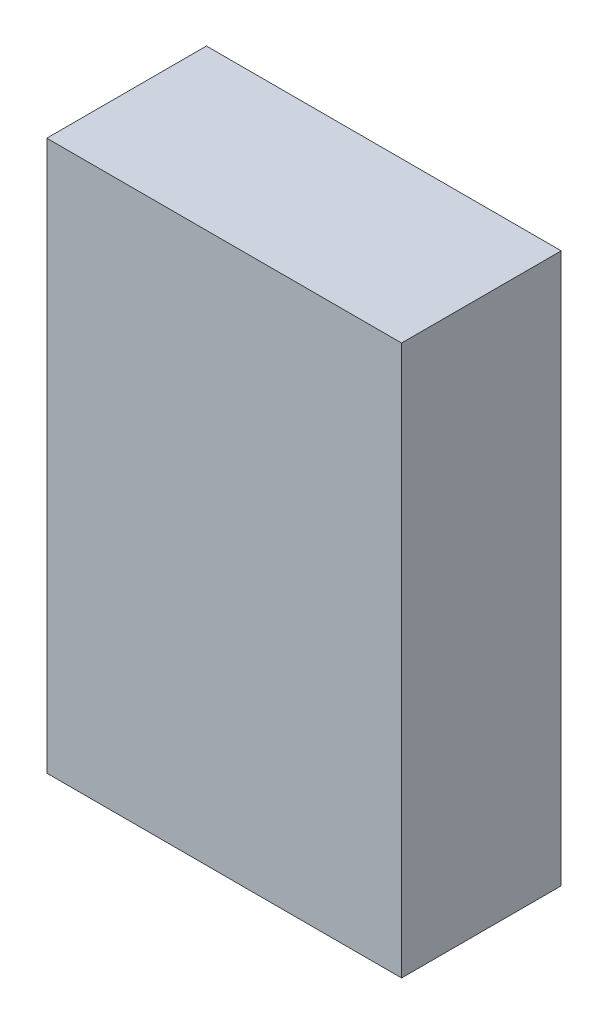
ISO-10303-21;
HEADER;
FILE_DESCRIPTION(('STEP AP214'),'2;1');
FILE_NAME('part.step','',(''),(''),'','','');
FILE_SCHEMA(('AUTOMOTIVE_DESIGN { 1 0 10303 214 1 1 1 1 }'));
ENDSEC;
DATA;
#1=APPLICATION_CONTEXT('core data for automotive mechanical design processes');
#2=APPLICATION_PROTOCOL_DEFINITION('international standard','automotive_design',2000,#1);
#3=PRODUCT_CONTEXT('',#1,'mechanical');
#4=PRODUCT('Part','Part','',(#3));
#5=PRODUCT_RELATED_PRODUCT_CATEGORY('part','',(#4));
#6=PRODUCT_DEFINITION_FORMATION('','',#4);
#7=PRODUCT_DEFINITION_CONTEXT('part definition',#1,'design');
#8=PRODUCT_DEFINITION('design','',#6,#7);
#9=PRODUCT_DEFINITION_SHAPE('','',#8);
#10=(LENGTH_UNIT() NAMED_UNIT(*) SI_UNIT(.MILLI.,.METRE.));
#11=(NAMED_UNIT(*) PLANE_ANGLE_UNIT() SI_UNIT($,.RADIAN.));
#12=(NAMED_UNIT(*) SI_UNIT($,.STERADIAN.) SOLID_ANGLE_UNIT());
#13=UNCERTAINTY_MEASURE_WITH_UNIT(LENGTH_MEASURE(1.E-05),#10,'distance_accuracy_value','');
#14=(GEOMETRIC_REPRESENTATION_CONTEXT(3) GLOBAL_UNCERTAINTY_ASSIGNED_CONTEXT((#13)) GLOBAL_UNIT_ASSIGNED_CONTEXT((#10,
#11,#12)) REPRESENTATION_CONTEXT('',''));
#15=CARTESIAN_POINT('',(0.,0.,0.));
#16=DIRECTION('',(0.,0.,1.));
#17=DIRECTION('',(1.,0.,0.));
#18=AXIS2_PLACEMENT_3D('',#15,#16,#17);
#19=CARTESIAN_POINT('',(-28.0820979020979,37.0905128205128,9.));
#20=DIRECTION('',(1.,0.,0.));
#21=DIRECTION('',(0.,0.,-1.));
#22=AXIS2_PLACEMENT_3D('',#19,#20,#21);
#23=PLANE('',#22);
#24=DIRECTION('',(0.,-1.,0.));
#25=VECTOR('',#24,1.);
#26=CARTESIAN_POINT('',(-28.0820979020979,37.0905128205128,0.));
#27=LINE('',#26,#25);
#28=CARTESIAN_POINT('',(-28.0820979020979,37.0905128205128,0.));
#29=VERTEX_POINT('',#28);
#30=CARTESIAN_POINT('',(-28.0820979020979,6.09051282051283,0.));
#31=VERTEX_POINT('',#30);
#32=EDGE_CURVE('E94',#29,#31,#27,.T.);
#33=ORIENTED_EDGE('',*,*,#32,.T.);
#34=DIRECTION('',(0.,0.,-1.));
#35=VECTOR('',#34,1.);
#36=CARTESIAN_POINT('',(-28.0820979020979,6.09051282051283,9.));
#37=LINE('',#36,#35);
#38=CARTESIAN_POINT('',(-28.0820979020979,6.09051282051283,9.));
#39=VERTEX_POINT('',#38);
#40=EDGE_CURVE('E11',#39,#31,#37,.T.);
#41=ORIENTED_EDGE('',*,*,#40,.F.);
#42=DIRECTION('',(0.,-1.,0.));
#43=VECTOR('',#42,1.);
#44=CARTESIAN_POINT('',(-28.0820979020979,37.0905128205128,9.));
#45=LINE('',#44,#43);
#46=CARTESIAN_POINT('',(-28.0820979020979,37.0905128205128,9.));
#47=VERTEX_POINT('',#46);
#48=EDGE_CURVE('E82',#47,#39,#45,.T.);
#49=ORIENTED_EDGE('',*,*,#48,.F.);
#50=DIRECTION('',(0.,0.,-1.));
#51=VECTOR('',#50,1.);
#52=CARTESIAN_POINT('',(-28.0820979020979,37.0905128205128,9.));
#53=LINE('',#52,#51);
#54=EDGE_CURVE('E90',#47,#29,#53,.T.);
#55=ORIENTED_EDGE('',*,*,#54,.T.);
#56=EDGE_LOOP('',(#33,#41,#49,#55));
#57=FACE_BOUND('',#56,.T.);
#58=ADVANCED_FACE('F31',(#57),#23,.F.);
#59=CARTESIAN_POINT('',(-28.0820979020979,6.09051282051283,9.));
#60=DIRECTION('',(0.,1.,0.));
#61=DIRECTION('',(0.,0.,1.));
#62=AXIS2_PLACEMENT_3D('',#59,#60,#61);
#63=PLANE('',#62);
#64=DIRECTION('',(1.,0.,0.));
#65=VECTOR('',#64,1.);
#66=CARTESIAN_POINT('',(-28.0820979020979,6.09051282051283,0.));
#67=LINE('',#66,#65);
#68=CARTESIAN_POINT('',(-8.08209790209793,6.09051282051283,0.));
#69=VERTEX_POINT('',#68);
#70=EDGE_CURVE('E86',#31,#69,#67,.T.);
#71=ORIENTED_EDGE('',*,*,#70,.T.);
#72=DIRECTION('',(0.,0.,-1.));
#73=VECTOR('',#72,1.);
#74=CARTESIAN_POINT('',(-8.08209790209793,6.09051282051283,9.));
#75=LINE('',#74,#73);
#76=CARTESIAN_POINT('',(-8.08209790209793,6.09051282051283,9.));
#77=VERTEX_POINT('',#76);
#78=EDGE_CURVE('E39',#77,#69,#75,.T.);
#79=ORIENTED_EDGE('',*,*,#78,.F.);
#80=DIRECTION('',(1.,0.,0.));
#81=VECTOR('',#80,1.);
#82=CARTESIAN_POINT('',(-28.0820979020979,6.09051282051283,9.));
#83=LINE('',#82,#81);
#84=EDGE_CURVE('E77',#39,#77,#83,.T.);
#85=ORIENTED_EDGE('',*,*,#84,.F.);
#86=ORIENTED_EDGE('',*,*,#40,.T.);
#87=EDGE_LOOP('',(#71,#79,#85,#86));
#88=FACE_BOUND('',#87,.T.);
#89=ADVANCED_FACE('F85',(#88),#63,.F.);
#90=CARTESIAN_POINT('',(-8.08209790209793,37.0905128205128,9.));
#91=DIRECTION('',(-1.,0.,0.));
#92=DIRECTION('',(0.,-1.,0.));
#93=AXIS2_PLACEMENT_3D('',#90,#91,#92);
#94=PLANE('',#93);
#95=DIRECTION('',(0.,1.,0.));
#96=VECTOR('',#95,1.);
#97=CARTESIAN_POINT('',(-8.08209790209793,37.0905128205128,0.));
#98=LINE('',#97,#96);
#99=CARTESIAN_POINT('',(-8.08209790209793,37.0905128205128,0.));
#100=VERTEX_POINT('',#99);
#101=EDGE_CURVE('E64',#69,#100,#98,.T.);
#102=ORIENTED_EDGE('',*,*,#101,.T.);
#103=DIRECTION('',(0.,0.,-1.));
#104=VECTOR('',#103,1.);
#105=CARTESIAN_POINT('',(-8.08209790209793,37.0905128205128,9.));
#106=LINE('',#105,#104);
#107=CARTESIAN_POINT('',(-8.08209790209793,37.0905128205128,9.));
#108=VERTEX_POINT('',#107);
#109=EDGE_CURVE('E87',#108,#100,#106,.T.);
#110=ORIENTED_EDGE('',*,*,#109,.F.);
#111=DIRECTION('',(0.,1.,0.));
#112=VECTOR('',#111,1.);
#113=CARTESIAN_POINT('',(-8.08209790209793,37.0905128205128,9.));
#114=LINE('',#113,#112);
#115=EDGE_CURVE('E80',#77,#108,#114,.T.);
#116=ORIENTED_EDGE('',*,*,#115,.F.);
#117=ORIENTED_EDGE('',*,*,#78,.T.);
#118=EDGE_LOOP('',(#102,#110,#116,#117));
#119=FACE_BOUND('',#118,.T.);
#120=ADVANCED_FACE('F88',(#119),#94,.F.);
#121=CARTESIAN_POINT('',(-28.0820979020979,37.0905128205128,9.));
#122=DIRECTION('',(0.,-1.,0.));
#123=DIRECTION('',(0.,0.,-1.));
#124=AXIS2_PLACEMENT_3D('',#121,#122,#123);
#125=PLANE('',#124);
#126=DIRECTION('',(-1.,0.,0.));
#127=VECTOR('',#126,1.);
#128=CARTESIAN_POINT('',(-28.0820979020979,37.0905128205128,0.));
#129=LINE('',#128,#127);
#130=EDGE_CURVE('E70',#100,#29,#129,.T.);
#131=ORIENTED_EDGE('',*,*,#130,.T.);
#132=ORIENTED_EDGE('',*,*,#54,.F.);
#133=DIRECTION('',(-1.,0.,0.));
#134=VECTOR('',#133,1.);
#135=CARTESIAN_POINT('',(-28.0820979020979,37.0905128205128,9.));
#136=LINE('',#135,#134);
#137=EDGE_CURVE('E47',#108,#47,#136,.T.);
#138=ORIENTED_EDGE('',*,*,#137,.F.);
#139=ORIENTED_EDGE('',*,*,#109,.T.);
#140=EDGE_LOOP('',(#131,#132,#138,#139));
#141=FACE_BOUND('',#140,.T.);
#142=ADVANCED_FACE('F101',(#141),#125,.F.);
#143=CARTESIAN_POINT('',(-28.0820979020979,6.09051282051283,9.));
#144=DIRECTION('',(0.,0.,1.));
#145=DIRECTION('',(1.,0.,0.));
#146=AXIS2_PLACEMENT_3D('',#143,#144,#145);
#147=PLANE('',#146);
#148=ORIENTED_EDGE('',*,*,#48,.T.);
#149=ORIENTED_EDGE('',*,*,#84,.T.);
#150=ORIENTED_EDGE('',*,*,#115,.T.);
#151=ORIENTED_EDGE('',*,*,#137,.T.);
#152=EDGE_LOOP('',(#148,#149,#150,#151));
#153=FACE_BOUND('',#152,.T.);
#154=ADVANCED_FACE('F78',(#153),#147,.T.);
#155=CARTESIAN_POINT('',(-28.0820979020979,6.09051282051283,0.));
#156=DIRECTION('',(0.,0.,1.));
#157=DIRECTION('',(1.,0.,0.));
#158=AXIS2_PLACEMENT_3D('',#155,#156,#157);
#159=PLANE('',#158);
#160=ORIENTED_EDGE('',*,*,#32,.F.);
#161=ORIENTED_EDGE('',*,*,#130,.F.);
#162=ORIENTED_EDGE('',*,*,#101,.F.);
#163=ORIENTED_EDGE('',*,*,#70,.F.);
#164=EDGE_LOOP('',(#160,#161,#162,#163));
#165=FACE_BOUND('',#164,.T.);
#166=ADVANCED_FACE('F104',(#165),#159,.F.);
#167=CLOSED_SHELL('',(#58,#89,#120,#142,#154,#166));
#168=MANIFOLD_SOLID_BREP('B2',#167);
#169=ADVANCED_BREP_SHAPE_REPRESENTATION('',(#18,#168),#14);
#170=SHAPE_DEFINITION_REPRESENTATION(#9,#169);
ENDSEC;
END-ISO-10303-21;
